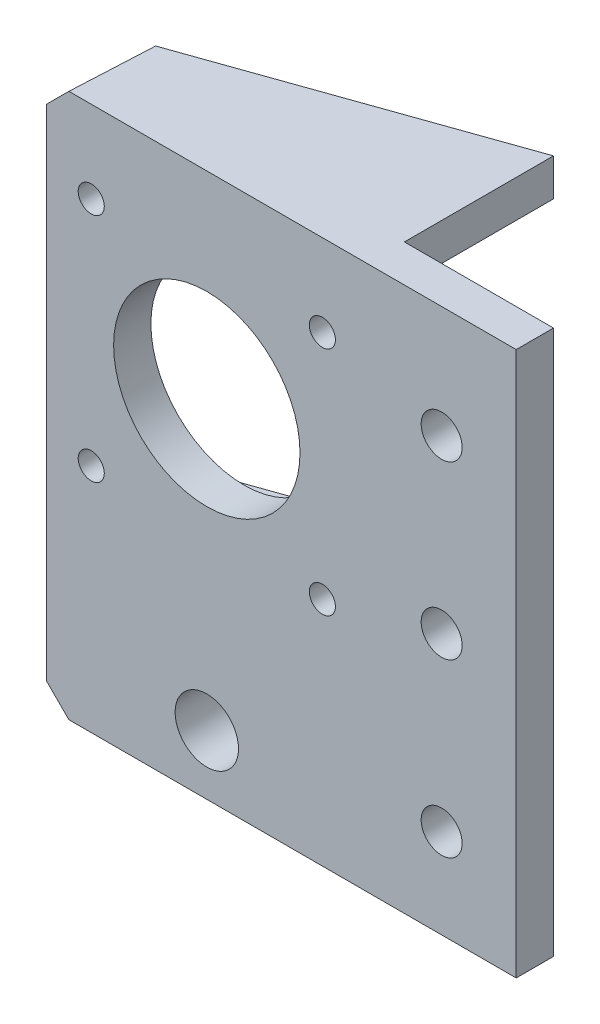
ISO-10303-21;
HEADER;
FILE_DESCRIPTION(('STEP AP214'),'2;1');
FILE_NAME('part.step','',(''),(''),'','','');
FILE_SCHEMA(('AUTOMOTIVE_DESIGN { 1 0 10303 214 1 1 1 1 }'));
ENDSEC;
DATA;
#1=APPLICATION_CONTEXT('core data for automotive mechanical design processes');
#2=APPLICATION_PROTOCOL_DEFINITION('international standard','automotive_design',2000,#1);
#3=PRODUCT_CONTEXT('',#1,'mechanical');
#4=PRODUCT('Part','Part','',(#3));
#5=PRODUCT_RELATED_PRODUCT_CATEGORY('part','',(#4));
#6=PRODUCT_DEFINITION_FORMATION('','',#4);
#7=PRODUCT_DEFINITION_CONTEXT('part definition',#1,'design');
#8=PRODUCT_DEFINITION('design','',#6,#7);
#9=PRODUCT_DEFINITION_SHAPE('','',#8);
#10=(LENGTH_UNIT() NAMED_UNIT(*) SI_UNIT(.MILLI.,.METRE.));
#11=(NAMED_UNIT(*) PLANE_ANGLE_UNIT() SI_UNIT($,.RADIAN.));
#12=(NAMED_UNIT(*) SI_UNIT($,.STERADIAN.) SOLID_ANGLE_UNIT());
#13=UNCERTAINTY_MEASURE_WITH_UNIT(LENGTH_MEASURE(1.E-05),#10,'distance_accuracy_value','');
#14=(GEOMETRIC_REPRESENTATION_CONTEXT(3) GLOBAL_UNCERTAINTY_ASSIGNED_CONTEXT((#13)) GLOBAL_UNIT_ASSIGNED_CONTEXT((#10,
#11,#12)) REPRESENTATION_CONTEXT('',''));
#15=CARTESIAN_POINT('',(0.,0.,0.));
#16=DIRECTION('',(0.,0.,1.));
#17=DIRECTION('',(1.,0.,0.));
#18=AXIS2_PLACEMENT_3D('',#15,#16,#17);
#19=CARTESIAN_POINT('',(23.027972027972,16.9685314685315,-20.));
#20=DIRECTION('',(-1.,0.,0.));
#21=DIRECTION('',(0.,0.,1.));
#22=AXIS2_PLACEMENT_3D('',#19,#20,#21);
#23=PLANE('',#22);
#24=DIRECTION('',(0.,-1.,0.));
#25=VECTOR('',#24,1.);
#26=CARTESIAN_POINT('',(23.027972027972,16.9685314685315,0.));
#27=LINE('',#26,#25);
#28=CARTESIAN_POINT('',(23.027972027972,16.9685314685315,0.));
#29=VERTEX_POINT('',#28);
#30=CARTESIAN_POINT('',(23.027972027972,11.9685314685315,0.));
#31=VERTEX_POINT('',#30);
#32=EDGE_CURVE('E169',#29,#31,#27,.T.);
#33=ORIENTED_EDGE('',*,*,#32,.T.);
#34=DIRECTION('',(0.,0.,-1.));
#35=VECTOR('',#34,1.);
#36=CARTESIAN_POINT('',(23.027972027972,11.9685314685315,-20.));
#37=LINE('',#36,#35);
#38=CARTESIAN_POINT('',(23.027972027972,11.9685314685315,-20.));
#39=VERTEX_POINT('',#38);
#40=EDGE_CURVE('E212',#31,#39,#37,.T.);
#41=ORIENTED_EDGE('',*,*,#40,.T.);
#42=DIRECTION('',(0.,-1.,0.));
#43=VECTOR('',#42,1.);
#44=CARTESIAN_POINT('',(23.027972027972,16.9685314685315,-20.));
#45=LINE('',#44,#43);
#46=CARTESIAN_POINT('',(23.027972027972,16.9685314685315,-20.));
#47=VERTEX_POINT('',#46);
#48=EDGE_CURVE('E228',#47,#39,#45,.T.);
#49=ORIENTED_EDGE('',*,*,#48,.F.);
#50=DIRECTION('',(0.,0.,-1.));
#51=VECTOR('',#50,1.);
#52=CARTESIAN_POINT('',(23.027972027972,16.9685314685315,-20.));
#53=LINE('',#52,#51);
#54=EDGE_CURVE('E151',#29,#47,#53,.T.);
#55=ORIENTED_EDGE('',*,*,#54,.F.);
#56=EDGE_LOOP('',(#33,#41,#49,#55));
#57=FACE_BOUND('',#56,.T.);
#58=ADVANCED_FACE('F39',(#57),#23,.F.);
#59=CARTESIAN_POINT('',(-19.972027972028,11.9685314685315,5.));
#60=DIRECTION('',(0.,-1.,0.));
#61=DIRECTION('',(0.,0.,-1.));
#62=AXIS2_PLACEMENT_3D('',#59,#60,#61);
#63=PLANE('',#62);
#64=DIRECTION('',(-0.0499376169439517,0.,0.998752338877842));
#65=VECTOR('',#64,1.);
#66=CARTESIAN_POINT('',(-19.972027972028,11.9685314685315,5.));
#67=LINE('',#66,#65);
#68=CARTESIAN_POINT('',(-19.7220279720277,11.9685314685315,0.));
#69=VERTEX_POINT('',#68);
#70=CARTESIAN_POINT('',(-19.972027972028,11.9685314685315,5.));
#71=VERTEX_POINT('',#70);
#72=EDGE_CURVE('E224',#69,#71,#67,.T.);
#73=ORIENTED_EDGE('',*,*,#72,.F.);
#74=DIRECTION('',(-1.,0.,0.));
#75=VECTOR('',#74,1.);
#76=CARTESIAN_POINT('',(-19.972027972028,11.9685314685315,0.));
#77=LINE('',#76,#75);
#78=CARTESIAN_POINT('',(-19.972027972028,11.9685314685315,0.));
#79=VERTEX_POINT('',#78);
#80=EDGE_CURVE('E293',#69,#79,#77,.T.);
#81=ORIENTED_EDGE('',*,*,#80,.T.);
#82=DIRECTION('',(0.,0.,-1.));
#83=VECTOR('',#82,1.);
#84=CARTESIAN_POINT('',(-19.972027972028,11.9685314685315,5.));
#85=LINE('',#84,#83);
#86=EDGE_CURVE('E163',#71,#79,#85,.T.);
#87=ORIENTED_EDGE('',*,*,#86,.F.);
#88=EDGE_LOOP('',(#73,#81,#87));
#89=FACE_BOUND('',#88,.T.);
#90=ADVANCED_FACE('F337',(#89),#63,.F.);
#91=CARTESIAN_POINT('',(0.,0.,0.));
#92=DIRECTION('',(0.,0.,1.));
#93=DIRECTION('',(1.,0.,0.));
#94=AXIS2_PLACEMENT_3D('',#91,#92,#93);
#95=PLANE('',#94);
#96=CARTESIAN_POINT('',(33.027972027972,-44.0314685314685,0.));
#97=DIRECTION('',(0.,0.,1.));
#98=DIRECTION('',(1.,0.,0.));
#99=AXIS2_PLACEMENT_3D('',#96,#97,#98);
#100=CIRCLE('',#99,2.75);
#101=CARTESIAN_POINT('',(35.777972027972,-44.0314685314685,0.));
#102=VERTEX_POINT('',#101);
#103=EDGE_CURVE('E178',#102,#102,#100,.T.);
#104=ORIENTED_EDGE('',*,*,#103,.T.);
#105=EDGE_LOOP('',(#104));
#106=FACE_BOUND('',#105,.T.);
#107=DIRECTION('',(0.,1.,0.));
#108=VECTOR('',#107,1.);
#109=CARTESIAN_POINT('',(-19.7220279720277,-36.0314685314685,0.));
#110=LINE('',#109,#108);
#111=CARTESIAN_POINT('',(-19.7220279720277,-36.0314685314685,0.));
#112=VERTEX_POINT('',#111);
#113=CARTESIAN_POINT('',(-19.7220279720277,-31.0314685314685,0.));
#114=VERTEX_POINT('',#113);
#115=EDGE_CURVE('E205',#112,#114,#110,.T.);
#116=ORIENTED_EDGE('',*,*,#115,.F.);
#117=DIRECTION('',(-1.,0.,0.));
#118=VECTOR('',#117,1.);
#119=CARTESIAN_POINT('',(23.027972027972,-36.0314685314685,0.));
#120=LINE('',#119,#118);
#121=CARTESIAN_POINT('',(23.027972027972,-36.0314685314685,0.));
#122=VERTEX_POINT('',#121);
#123=EDGE_CURVE('E189',#122,#112,#120,.T.);
#124=ORIENTED_EDGE('',*,*,#123,.F.);
#125=DIRECTION('',(0.,1.,0.));
#126=VECTOR('',#125,1.);
#127=CARTESIAN_POINT('',(23.027972027972,-36.0314685314685,0.));
#128=LINE('',#127,#126);
#129=CARTESIAN_POINT('',(23.027972027972,-31.0314685314685,0.));
#130=VERTEX_POINT('',#129);
#131=EDGE_CURVE('E208',#122,#130,#128,.T.);
#132=ORIENTED_EDGE('',*,*,#131,.T.);
#133=DIRECTION('',(-1.,0.,0.));
#134=VECTOR('',#133,1.);
#135=CARTESIAN_POINT('',(23.027972027972,-31.0314685314685,0.));
#136=LINE('',#135,#134);
#137=EDGE_CURVE('E200',#130,#114,#136,.T.);
#138=ORIENTED_EDGE('',*,*,#137,.T.);
#139=EDGE_LOOP('',(#116,#124,#132,#138));
#140=FACE_BOUND('',#139,.T.);
#141=CARTESIAN_POINT('',(33.027972027972,-21.0314685314685,0.));
#142=DIRECTION('',(0.,0.,1.));
#143=DIRECTION('',(1.,0.,0.));
#144=AXIS2_PLACEMENT_3D('',#141,#142,#143);
#145=CIRCLE('',#144,2.75);
#146=CARTESIAN_POINT('',(35.777972027972,-21.0314685314685,0.));
#147=VERTEX_POINT('',#146);
#148=EDGE_CURVE('E245',#147,#147,#145,.T.);
#149=ORIENTED_EDGE('',*,*,#148,.T.);
#150=EDGE_LOOP('',(#149));
#151=FACE_BOUND('',#150,.T.);
#152=CARTESIAN_POINT('',(33.027972027972,1.96853146853145,0.));
#153=DIRECTION('',(0.,0.,1.));
#154=DIRECTION('',(1.,0.,0.));
#155=AXIS2_PLACEMENT_3D('',#152,#153,#154);
#156=CIRCLE('',#155,2.75);
#157=CARTESIAN_POINT('',(35.777972027972,1.96853146853145,0.));
#158=VERTEX_POINT('',#157);
#159=EDGE_CURVE('E249',#158,#158,#156,.T.);
#160=ORIENTED_EDGE('',*,*,#159,.T.);
#161=EDGE_LOOP('',(#160));
#162=FACE_BOUND('',#161,.T.);
#163=CARTESIAN_POINT('',(1.52797202797203,-9.53146853146854,0.));
#164=DIRECTION('',(0.,0.,1.));
#165=DIRECTION('',(1.,0.,0.));
#166=AXIS2_PLACEMENT_3D('',#163,#164,#165);
#167=CIRCLE('',#166,12.5);
#168=CARTESIAN_POINT('',(14.027972027972,-9.53146853146854,0.));
#169=VERTEX_POINT('',#168);
#170=EDGE_CURVE('E255',#169,#169,#167,.T.);
#171=ORIENTED_EDGE('',*,*,#170,.T.);
#172=EDGE_LOOP('',(#171));
#173=FACE_BOUND('',#172,.T.);
#174=CARTESIAN_POINT('',(-13.972027972028,-25.0314685314685,0.));
#175=DIRECTION('',(0.,0.,1.));
#176=DIRECTION('',(1.,0.,0.));
#177=AXIS2_PLACEMENT_3D('',#174,#175,#176);
#178=CIRCLE('',#177,1.75);
#179=CARTESIAN_POINT('',(-12.222027972028,-25.0314685314685,0.));
#180=VERTEX_POINT('',#179);
#181=EDGE_CURVE('E261',#180,#180,#178,.T.);
#182=ORIENTED_EDGE('',*,*,#181,.T.);
#183=EDGE_LOOP('',(#182));
#184=FACE_BOUND('',#183,.T.);
#185=CARTESIAN_POINT('',(17.027972027972,-25.0314685314685,0.));
#186=DIRECTION('',(0.,0.,1.));
#187=DIRECTION('',(1.,0.,0.));
#188=AXIS2_PLACEMENT_3D('',#185,#186,#187);
#189=CIRCLE('',#188,1.75);
#190=CARTESIAN_POINT('',(18.777972027972,-25.0314685314685,0.));
#191=VERTEX_POINT('',#190);
#192=EDGE_CURVE('E267',#191,#191,#189,.T.);
#193=ORIENTED_EDGE('',*,*,#192,.T.);
#194=EDGE_LOOP('',(#193));
#195=FACE_BOUND('',#194,.T.);
#196=CARTESIAN_POINT('',(17.027972027972,5.96853146853146,0.));
#197=DIRECTION('',(0.,0.,1.));
#198=DIRECTION('',(1.,0.,0.));
#199=AXIS2_PLACEMENT_3D('',#196,#197,#198);
#200=CIRCLE('',#199,1.75);
#201=CARTESIAN_POINT('',(18.777972027972,5.96853146853146,0.));
#202=VERTEX_POINT('',#201);
#203=EDGE_CURVE('E273',#202,#202,#200,.T.);
#204=ORIENTED_EDGE('',*,*,#203,.T.);
#205=EDGE_LOOP('',(#204));
#206=FACE_BOUND('',#205,.T.);
#207=CARTESIAN_POINT('',(-13.972027972028,5.96853146853146,0.));
#208=DIRECTION('',(0.,0.,1.));
#209=DIRECTION('',(1.,0.,0.));
#210=AXIS2_PLACEMENT_3D('',#207,#208,#209);
#211=CIRCLE('',#210,1.75);
#212=CARTESIAN_POINT('',(-12.222027972028,5.96853146853146,0.));
#213=VERTEX_POINT('',#212);
#214=EDGE_CURVE('E279',#213,#213,#211,.T.);
#215=ORIENTED_EDGE('',*,*,#214,.T.);
#216=EDGE_LOOP('',(#215));
#217=FACE_BOUND('',#216,.T.);
#218=DIRECTION('',(1.,0.,0.));
#219=VECTOR('',#218,1.);
#220=CARTESIAN_POINT('',(-19.972027972028,-56.0314685314685,0.));
#221=LINE('',#220,#219);
#222=CARTESIAN_POINT('',(-16.972027972028,-56.0314685314685,0.));
#223=VERTEX_POINT('',#222);
#224=CARTESIAN_POINT('',(43.027972027972,-56.0314685314685,0.));
#225=VERTEX_POINT('',#224);
#226=EDGE_CURVE('E240',#223,#225,#221,.T.);
#227=ORIENTED_EDGE('',*,*,#226,.F.);
#228=DIRECTION('',(-0.707106781186547,0.707106781186548,0.));
#229=VECTOR('',#228,1.);
#230=CARTESIAN_POINT('',(-16.972027972028,-56.0314685314685,0.));
#231=LINE('',#230,#229);
#232=CARTESIAN_POINT('',(-19.972027972028,-53.0314685314685,0.));
#233=VERTEX_POINT('',#232);
#234=EDGE_CURVE('E47',#223,#233,#231,.T.);
#235=ORIENTED_EDGE('',*,*,#234,.T.);
#236=DIRECTION('',(0.,-1.,0.));
#237=VECTOR('',#236,1.);
#238=CARTESIAN_POINT('',(-19.972027972028,11.9685314685315,0.));
#239=LINE('',#238,#237);
#240=EDGE_CURVE('E285',#79,#233,#239,.T.);
#241=ORIENTED_EDGE('',*,*,#240,.F.);
#242=ORIENTED_EDGE('',*,*,#80,.F.);
#243=EDGE_CURVE('E289',#31,#69,#77,.T.);
#244=ORIENTED_EDGE('',*,*,#243,.F.);
#245=ORIENTED_EDGE('',*,*,#32,.F.);
#246=DIRECTION('',(-1.,0.,0.));
#247=VECTOR('',#246,1.);
#248=CARTESIAN_POINT('',(43.027972027972,16.9685314685315,0.));
#249=LINE('',#248,#247);
#250=CARTESIAN_POINT('',(43.027972027972,16.9685314685315,0.));
#251=VERTEX_POINT('',#250);
#252=EDGE_CURVE('E170',#251,#29,#249,.T.);
#253=ORIENTED_EDGE('',*,*,#252,.F.);
#254=DIRECTION('',(0.,1.,0.));
#255=VECTOR('',#254,1.);
#256=CARTESIAN_POINT('',(43.027972027972,11.9685314685315,0.));
#257=LINE('',#256,#255);
#258=EDGE_CURVE('E168',#225,#251,#257,.T.);
#259=ORIENTED_EDGE('',*,*,#258,.F.);
#260=EDGE_LOOP('',(#227,#235,#241,#242,#244,#245,#253,#259));
#261=FACE_BOUND('',#260,.T.);
#262=CARTESIAN_POINT('',(1.52797202797204,-48.0314685314685,0.));
#263=DIRECTION('',(0.,0.,1.));
#264=DIRECTION('',(1.,0.,0.));
#265=AXIS2_PLACEMENT_3D('',#262,#263,#264);
#266=CIRCLE('',#265,7.75);
#267=CARTESIAN_POINT('',(9.27797202797204,-48.0314685314685,0.));
#268=VERTEX_POINT('',#267);
#269=EDGE_CURVE('E297',#268,#268,#266,.F.);
#270=ORIENTED_EDGE('',*,*,#269,.F.);
#271=EDGE_LOOP('',(#270));
#272=FACE_BOUND('',#271,.T.);
#273=ADVANCED_FACE('F313',(#106,#140,#151,#162,#173,#184,#195,#206,#217,#261,#272),#95,.F.);
#274=CARTESIAN_POINT('',(0.,0.,5.));
#275=DIRECTION('',(0.,0.,1.));
#276=DIRECTION('',(1.,0.,0.));
#277=AXIS2_PLACEMENT_3D('',#274,#275,#276);
#278=PLANE('',#277);
#279=CARTESIAN_POINT('',(33.027972027972,-44.0314685314685,5.));
#280=DIRECTION('',(0.,0.,1.));
#281=DIRECTION('',(1.,0.,0.));
#282=AXIS2_PLACEMENT_3D('',#279,#280,#281);
#283=CIRCLE('',#282,2.75);
#284=CARTESIAN_POINT('',(35.777972027972,-44.0314685314685,5.));
#285=VERTEX_POINT('',#284);
#286=EDGE_CURVE('E172',#285,#285,#283,.T.);
#287=ORIENTED_EDGE('',*,*,#286,.F.);
#288=EDGE_LOOP('',(#287));
#289=FACE_BOUND('',#288,.T.);
#290=CARTESIAN_POINT('',(1.52797202797204,-48.0314685314685,5.));
#291=DIRECTION('',(0.,0.,1.));
#292=DIRECTION('',(1.,0.,0.));
#293=AXIS2_PLACEMENT_3D('',#290,#291,#292);
#294=CIRCLE('',#293,4.25);
#295=CARTESIAN_POINT('',(5.77797202797204,-48.0314685314685,5.));
#296=VERTEX_POINT('',#295);
#297=EDGE_CURVE('E237',#296,#296,#294,.T.);
#298=ORIENTED_EDGE('',*,*,#297,.F.);
#299=EDGE_LOOP('',(#298));
#300=FACE_BOUND('',#299,.T.);
#301=CARTESIAN_POINT('',(33.027972027972,1.96853146853145,5.));
#302=DIRECTION('',(0.,0.,1.));
#303=DIRECTION('',(1.,0.,0.));
#304=AXIS2_PLACEMENT_3D('',#301,#302,#303);
#305=CIRCLE('',#304,2.75);
#306=CARTESIAN_POINT('',(35.777972027972,1.96853146853145,5.));
#307=VERTEX_POINT('',#306);
#308=EDGE_CURVE('E252',#307,#307,#305,.T.);
#309=ORIENTED_EDGE('',*,*,#308,.F.);
#310=EDGE_LOOP('',(#309));
#311=FACE_BOUND('',#310,.T.);
#312=CARTESIAN_POINT('',(-13.972027972028,-25.0314685314685,5.));
#313=DIRECTION('',(0.,0.,1.));
#314=DIRECTION('',(1.,0.,0.));
#315=AXIS2_PLACEMENT_3D('',#312,#313,#314);
#316=CIRCLE('',#315,1.75);
#317=CARTESIAN_POINT('',(-12.222027972028,-25.0314685314685,5.));
#318=VERTEX_POINT('',#317);
#319=EDGE_CURVE('E264',#318,#318,#316,.T.);
#320=ORIENTED_EDGE('',*,*,#319,.F.);
#321=EDGE_LOOP('',(#320));
#322=FACE_BOUND('',#321,.T.);
#323=CARTESIAN_POINT('',(17.027972027972,5.96853146853146,5.));
#324=DIRECTION('',(0.,0.,1.));
#325=DIRECTION('',(1.,0.,0.));
#326=AXIS2_PLACEMENT_3D('',#323,#324,#325);
#327=CIRCLE('',#326,1.75);
#328=CARTESIAN_POINT('',(18.777972027972,5.96853146853146,5.));
#329=VERTEX_POINT('',#328);
#330=EDGE_CURVE('E276',#329,#329,#327,.T.);
#331=ORIENTED_EDGE('',*,*,#330,.F.);
#332=EDGE_LOOP('',(#331));
#333=FACE_BOUND('',#332,.T.);
#334=DIRECTION('',(1.,0.,0.));
#335=VECTOR('',#334,1.);
#336=CARTESIAN_POINT('',(23.027972027972,16.9685314685315,5.));
#337=LINE('',#336,#335);
#338=CARTESIAN_POINT('',(-16.9682803128529,16.9685314685315,5.));
#339=VERTEX_POINT('',#338);
#340=CARTESIAN_POINT('',(43.027972027972,16.9685314685315,5.));
#341=VERTEX_POINT('',#340);
#342=EDGE_CURVE('E140',#339,#341,#337,.T.);
#343=ORIENTED_EDGE('',*,*,#342,.F.);
#344=DIRECTION('',(-0.707548033511042,-0.706665253337574,0.));
#345=VECTOR('',#344,1.);
#346=CARTESIAN_POINT('',(-16.9578073436204,16.9789913710474,5.));
#347=LINE('',#346,#345);
#348=CARTESIAN_POINT('',(-19.972027972028,13.9685314685315,5.));
#349=VERTEX_POINT('',#348);
#350=EDGE_CURVE('E303',#339,#349,#347,.T.);
#351=ORIENTED_EDGE('',*,*,#350,.T.);
#352=DIRECTION('',(0.,-1.,0.));
#353=VECTOR('',#352,1.);
#354=CARTESIAN_POINT('',(-19.972027972028,16.9685314685315,5.));
#355=LINE('',#354,#353);
#356=EDGE_CURVE('E217',#349,#71,#355,.T.);
#357=ORIENTED_EDGE('',*,*,#356,.T.);
#358=DIRECTION('',(0.,-1.,0.));
#359=VECTOR('',#358,1.);
#360=CARTESIAN_POINT('',(-19.972027972028,11.9685314685315,5.));
#361=LINE('',#360,#359);
#362=CARTESIAN_POINT('',(-19.972027972028,-53.0314685314685,5.));
#363=VERTEX_POINT('',#362);
#364=EDGE_CURVE('E164',#71,#363,#361,.T.);
#365=ORIENTED_EDGE('',*,*,#364,.T.);
#366=DIRECTION('',(0.707106781186547,-0.707106781186548,0.));
#367=VECTOR('',#366,1.);
#368=CARTESIAN_POINT('',(-36.5017482517483,-36.5017482517482,5.));
#369=LINE('',#368,#367);
#370=CARTESIAN_POINT('',(-16.972027972028,-56.0314685314685,5.));
#371=VERTEX_POINT('',#370);
#372=EDGE_CURVE('E301',#363,#371,#369,.T.);
#373=ORIENTED_EDGE('',*,*,#372,.T.);
#374=DIRECTION('',(-1.,0.,0.));
#375=VECTOR('',#374,1.);
#376=CARTESIAN_POINT('',(43.027972027972,-56.0314685314685,5.));
#377=LINE('',#376,#375);
#378=CARTESIAN_POINT('',(43.027972027972,-56.0314685314685,5.));
#379=VERTEX_POINT('',#378);
#380=EDGE_CURVE('E159',#379,#371,#377,.T.);
#381=ORIENTED_EDGE('',*,*,#380,.F.);
#382=DIRECTION('',(0.,1.,0.));
#383=VECTOR('',#382,1.);
#384=CARTESIAN_POINT('',(43.027972027972,11.9685314685315,5.));
#385=LINE('',#384,#383);
#386=EDGE_CURVE('E155',#379,#341,#385,.T.);
#387=ORIENTED_EDGE('',*,*,#386,.T.);
#388=EDGE_LOOP('',(#343,#351,#357,#365,#373,#381,#387));
#389=FACE_BOUND('',#388,.T.);
#390=CARTESIAN_POINT('',(-13.972027972028,5.96853146853146,5.));
#391=DIRECTION('',(0.,0.,1.));
#392=DIRECTION('',(1.,0.,0.));
#393=AXIS2_PLACEMENT_3D('',#390,#391,#392);
#394=CIRCLE('',#393,1.75);
#395=CARTESIAN_POINT('',(-12.222027972028,5.96853146853146,5.));
#396=VERTEX_POINT('',#395);
#397=EDGE_CURVE('E282',#396,#396,#394,.T.);
#398=ORIENTED_EDGE('',*,*,#397,.F.);
#399=EDGE_LOOP('',(#398));
#400=FACE_BOUND('',#399,.T.);
#401=CARTESIAN_POINT('',(17.027972027972,-25.0314685314685,5.));
#402=DIRECTION('',(0.,0.,1.));
#403=DIRECTION('',(1.,0.,0.));
#404=AXIS2_PLACEMENT_3D('',#401,#402,#403);
#405=CIRCLE('',#404,1.75);
#406=CARTESIAN_POINT('',(18.777972027972,-25.0314685314685,5.));
#407=VERTEX_POINT('',#406);
#408=EDGE_CURVE('E270',#407,#407,#405,.T.);
#409=ORIENTED_EDGE('',*,*,#408,.F.);
#410=EDGE_LOOP('',(#409));
#411=FACE_BOUND('',#410,.T.);
#412=CARTESIAN_POINT('',(1.52797202797203,-9.53146853146854,5.));
#413=DIRECTION('',(0.,0.,1.));
#414=DIRECTION('',(1.,0.,0.));
#415=AXIS2_PLACEMENT_3D('',#412,#413,#414);
#416=CIRCLE('',#415,12.5);
#417=CARTESIAN_POINT('',(14.027972027972,-9.53146853146854,5.));
#418=VERTEX_POINT('',#417);
#419=EDGE_CURVE('E258',#418,#418,#416,.T.);
#420=ORIENTED_EDGE('',*,*,#419,.F.);
#421=EDGE_LOOP('',(#420));
#422=FACE_BOUND('',#421,.T.);
#423=CARTESIAN_POINT('',(33.027972027972,-21.0314685314685,5.));
#424=DIRECTION('',(0.,0.,1.));
#425=DIRECTION('',(1.,0.,0.));
#426=AXIS2_PLACEMENT_3D('',#423,#424,#425);
#427=CIRCLE('',#426,2.75);
#428=CARTESIAN_POINT('',(35.777972027972,-21.0314685314685,5.));
#429=VERTEX_POINT('',#428);
#430=EDGE_CURVE('E246',#429,#429,#427,.T.);
#431=ORIENTED_EDGE('',*,*,#430,.F.);
#432=EDGE_LOOP('',(#431));
#433=FACE_BOUND('',#432,.T.);
#434=ADVANCED_FACE('F156',(#289,#300,#311,#322,#333,#389,#400,#411,#422,#433),#278,.T.);
#435=CARTESIAN_POINT('',(-19.972027972028,11.9685314685315,5.));
#436=DIRECTION('',(1.,0.,0.));
#437=DIRECTION('',(0.,1.,0.));
#438=AXIS2_PLACEMENT_3D('',#435,#436,#437);
#439=PLANE('',#438);
#440=ORIENTED_EDGE('',*,*,#240,.T.);
#441=DIRECTION('',(0.,0.,1.));
#442=VECTOR('',#441,1.);
#443=CARTESIAN_POINT('',(-19.972027972028,-53.0314685314685,5.));
#444=LINE('',#443,#442);
#445=EDGE_CURVE('E11',#233,#363,#444,.T.);
#446=ORIENTED_EDGE('',*,*,#445,.T.);
#447=ORIENTED_EDGE('',*,*,#364,.F.);
#448=ORIENTED_EDGE('',*,*,#86,.T.);
#449=EDGE_LOOP('',(#440,#446,#447,#448));
#450=FACE_BOUND('',#449,.T.);
#451=ADVANCED_FACE('F401',(#450),#439,.F.);
#452=CARTESIAN_POINT('',(43.027972027972,11.9685314685315,5.));
#453=DIRECTION('',(-1.,0.,0.));
#454=DIRECTION('',(0.,0.,1.));
#455=AXIS2_PLACEMENT_3D('',#452,#453,#454);
#456=PLANE('',#455);
#457=ORIENTED_EDGE('',*,*,#258,.T.);
#458=DIRECTION('',(0.,0.,-1.));
#459=VECTOR('',#458,1.);
#460=CARTESIAN_POINT('',(43.027972027972,16.9685314685315,5.));
#461=LINE('',#460,#459);
#462=EDGE_CURVE('E146',#341,#251,#461,.T.);
#463=ORIENTED_EDGE('',*,*,#462,.F.);
#464=ORIENTED_EDGE('',*,*,#386,.F.);
#465=DIRECTION('',(0.,0.,1.));
#466=VECTOR('',#465,1.);
#467=CARTESIAN_POINT('',(43.027972027972,-56.0314685314685,0.));
#468=LINE('',#467,#466);
#469=EDGE_CURVE('E242',#225,#379,#468,.T.);
#470=ORIENTED_EDGE('',*,*,#469,.F.);
#471=EDGE_LOOP('',(#457,#463,#464,#470));
#472=FACE_BOUND('',#471,.T.);
#473=ADVANCED_FACE('F166',(#472),#456,.F.);
#474=CARTESIAN_POINT('',(-13.972027972028,5.96853146853146,5.));
#475=DIRECTION('',(0.,0.,-1.));
#476=DIRECTION('',(-1.,0.,0.));
#477=AXIS2_PLACEMENT_3D('',#474,#475,#476);
#478=CYLINDRICAL_SURFACE('',#477,1.75);
#479=ORIENTED_EDGE('',*,*,#397,.T.);
#480=EDGE_LOOP('',(#479));
#481=FACE_BOUND('',#480,.T.);
#482=ORIENTED_EDGE('',*,*,#214,.F.);
#483=EDGE_LOOP('',(#482));
#484=FACE_BOUND('',#483,.T.);
#485=ADVANCED_FACE('F394',(#481,#484),#478,.F.);
#486=CARTESIAN_POINT('',(17.027972027972,5.96853146853146,5.));
#487=DIRECTION('',(0.,0.,-1.));
#488=DIRECTION('',(-1.,0.,0.));
#489=AXIS2_PLACEMENT_3D('',#486,#487,#488);
#490=CYLINDRICAL_SURFACE('',#489,1.75);
#491=ORIENTED_EDGE('',*,*,#330,.T.);
#492=EDGE_LOOP('',(#491));
#493=FACE_BOUND('',#492,.T.);
#494=ORIENTED_EDGE('',*,*,#203,.F.);
#495=EDGE_LOOP('',(#494));
#496=FACE_BOUND('',#495,.T.);
#497=ADVANCED_FACE('F390',(#493,#496),#490,.F.);
#498=CARTESIAN_POINT('',(17.027972027972,-25.0314685314685,5.));
#499=DIRECTION('',(0.,0.,-1.));
#500=DIRECTION('',(-1.,0.,0.));
#501=AXIS2_PLACEMENT_3D('',#498,#499,#500);
#502=CYLINDRICAL_SURFACE('',#501,1.75);
#503=ORIENTED_EDGE('',*,*,#408,.T.);
#504=EDGE_LOOP('',(#503));
#505=FACE_BOUND('',#504,.T.);
#506=ORIENTED_EDGE('',*,*,#192,.F.);
#507=EDGE_LOOP('',(#506));
#508=FACE_BOUND('',#507,.T.);
#509=ADVANCED_FACE('F386',(#505,#508),#502,.F.);
#510=CARTESIAN_POINT('',(-13.972027972028,-25.0314685314685,5.));
#511=DIRECTION('',(0.,0.,-1.));
#512=DIRECTION('',(-1.,0.,0.));
#513=AXIS2_PLACEMENT_3D('',#510,#511,#512);
#514=CYLINDRICAL_SURFACE('',#513,1.75);
#515=ORIENTED_EDGE('',*,*,#319,.T.);
#516=EDGE_LOOP('',(#515));
#517=FACE_BOUND('',#516,.T.);
#518=ORIENTED_EDGE('',*,*,#181,.F.);
#519=EDGE_LOOP('',(#518));
#520=FACE_BOUND('',#519,.T.);
#521=ADVANCED_FACE('F382',(#517,#520),#514,.F.);
#522=CARTESIAN_POINT('',(1.52797202797203,-9.53146853146854,5.));
#523=DIRECTION('',(0.,0.,-1.));
#524=DIRECTION('',(-1.,0.,0.));
#525=AXIS2_PLACEMENT_3D('',#522,#523,#524);
#526=CYLINDRICAL_SURFACE('',#525,12.5);
#527=ORIENTED_EDGE('',*,*,#419,.T.);
#528=EDGE_LOOP('',(#527));
#529=FACE_BOUND('',#528,.T.);
#530=ORIENTED_EDGE('',*,*,#170,.F.);
#531=EDGE_LOOP('',(#530));
#532=FACE_BOUND('',#531,.T.);
#533=ADVANCED_FACE('F378',(#529,#532),#526,.F.);
#534=CARTESIAN_POINT('',(33.027972027972,1.96853146853145,5.));
#535=DIRECTION('',(0.,0.,-1.));
#536=DIRECTION('',(-1.,0.,0.));
#537=AXIS2_PLACEMENT_3D('',#534,#535,#536);
#538=CYLINDRICAL_SURFACE('',#537,2.75);
#539=ORIENTED_EDGE('',*,*,#308,.T.);
#540=EDGE_LOOP('',(#539));
#541=FACE_BOUND('',#540,.T.);
#542=ORIENTED_EDGE('',*,*,#159,.F.);
#543=EDGE_LOOP('',(#542));
#544=FACE_BOUND('',#543,.T.);
#545=ADVANCED_FACE('F374',(#541,#544),#538,.F.);
#546=CARTESIAN_POINT('',(33.027972027972,-21.0314685314685,5.));
#547=DIRECTION('',(0.,0.,-1.));
#548=DIRECTION('',(-1.,0.,0.));
#549=AXIS2_PLACEMENT_3D('',#546,#547,#548);
#550=CYLINDRICAL_SURFACE('',#549,2.75);
#551=ORIENTED_EDGE('',*,*,#430,.T.);
#552=EDGE_LOOP('',(#551));
#553=FACE_BOUND('',#552,.T.);
#554=ORIENTED_EDGE('',*,*,#148,.F.);
#555=EDGE_LOOP('',(#554));
#556=FACE_BOUND('',#555,.T.);
#557=ADVANCED_FACE('F371',(#553,#556),#550,.F.);
#558=CARTESIAN_POINT('',(0.,-56.0314685314685,0.));
#559=DIRECTION('',(0.,-1.,0.));
#560=DIRECTION('',(0.,0.,-1.));
#561=AXIS2_PLACEMENT_3D('',#558,#559,#560);
#562=PLANE('',#561);
#563=ORIENTED_EDGE('',*,*,#380,.T.);
#564=DIRECTION('',(0.,0.,-1.));
#565=VECTOR('',#564,1.);
#566=CARTESIAN_POINT('',(-16.972027972028,-56.0314685314685,0.));
#567=LINE('',#566,#565);
#568=EDGE_CURVE('E309',#371,#223,#567,.T.);
#569=ORIENTED_EDGE('',*,*,#568,.T.);
#570=ORIENTED_EDGE('',*,*,#226,.T.);
#571=ORIENTED_EDGE('',*,*,#469,.T.);
#572=EDGE_LOOP('',(#563,#569,#570,#571));
#573=FACE_BOUND('',#572,.T.);
#574=ADVANCED_FACE('F311',(#573),#562,.T.);
#575=CARTESIAN_POINT('',(1.52797202797204,-48.0314685314685,-20.));
#576=DIRECTION('',(0.,0.,1.));
#577=DIRECTION('',(1.,0.,0.));
#578=AXIS2_PLACEMENT_3D('',#575,#576,#577);
#579=CYLINDRICAL_SURFACE('',#578,4.25);
#580=ORIENTED_EDGE('',*,*,#297,.T.);
#581=EDGE_LOOP('',(#580));
#582=FACE_BOUND('',#581,.T.);
#583=CARTESIAN_POINT('',(1.52797202797204,-48.0314685314685,-10.));
#584=DIRECTION('',(0.,0.,-1.));
#585=DIRECTION('',(-1.,0.,0.));
#586=AXIS2_PLACEMENT_3D('',#583,#584,#585);
#587=CIRCLE('',#586,4.25);
#588=CARTESIAN_POINT('',(-2.72202797202796,-48.0314685314685,-10.));
#589=VERTEX_POINT('',#588);
#590=EDGE_CURVE('E231',#589,#589,#587,.T.);
#591=ORIENTED_EDGE('',*,*,#590,.T.);
#592=EDGE_LOOP('',(#591));
#593=FACE_BOUND('',#592,.T.);
#594=ADVANCED_FACE('F363',(#582,#593),#579,.F.);
#595=CARTESIAN_POINT('',(1.52797202797204,-48.0314685314685,-10.));
#596=DIRECTION('',(0.,0.,-1.));
#597=DIRECTION('',(-1.,0.,0.));
#598=AXIS2_PLACEMENT_3D('',#595,#596,#597);
#599=PLANE('',#598);
#600=CARTESIAN_POINT('',(1.52797202797204,-48.0314685314685,-10.));
#601=DIRECTION('',(0.,0.,-1.));
#602=DIRECTION('',(-1.,0.,0.));
#603=AXIS2_PLACEMENT_3D('',#600,#601,#602);
#604=CIRCLE('',#603,7.75);
#605=CARTESIAN_POINT('',(-6.22202797202796,-48.0314685314685,-10.));
#606=VERTEX_POINT('',#605);
#607=EDGE_CURVE('E234',#606,#606,#604,.T.);
#608=ORIENTED_EDGE('',*,*,#607,.T.);
#609=EDGE_LOOP('',(#608));
#610=FACE_BOUND('',#609,.T.);
#611=ORIENTED_EDGE('',*,*,#590,.F.);
#612=EDGE_LOOP('',(#611));
#613=FACE_BOUND('',#612,.T.);
#614=ADVANCED_FACE('F350',(#610,#613),#599,.T.);
#615=CARTESIAN_POINT('',(1.52797202797204,-48.0314685314685,-10.));
#616=DIRECTION('',(0.,0.,1.));
#617=DIRECTION('',(1.,0.,0.));
#618=AXIS2_PLACEMENT_3D('',#615,#616,#617);
#619=CYLINDRICAL_SURFACE('',#618,7.75);
#620=ORIENTED_EDGE('',*,*,#607,.F.);
#621=EDGE_LOOP('',(#620));
#622=FACE_BOUND('',#621,.T.);
#623=ORIENTED_EDGE('',*,*,#269,.T.);
#624=EDGE_LOOP('',(#623));
#625=FACE_BOUND('',#624,.T.);
#626=ADVANCED_FACE('F343',(#622,#625),#619,.T.);
#627=CARTESIAN_POINT('',(0.,11.9685314685315,0.));
#628=DIRECTION('',(0.,1.,0.));
#629=DIRECTION('',(0.,0.,1.));
#630=AXIS2_PLACEMENT_3D('',#627,#628,#629);
#631=PLANE('',#630);
#632=ORIENTED_EDGE('',*,*,#40,.F.);
#633=ORIENTED_EDGE('',*,*,#243,.T.);
#634=CARTESIAN_POINT('',(-19.4720279720274,11.9685314685315,-5.));
#635=VERTEX_POINT('',#634);
#636=EDGE_CURVE('E152',#635,#69,#67,.T.);
#637=ORIENTED_EDGE('',*,*,#636,.F.);
#638=DIRECTION('',(-0.942990333582888,0.,0.332820117735142));
#639=VECTOR('',#638,1.);
#640=CARTESIAN_POINT('',(-19.4720279720274,11.9685314685315,-5.));
#641=LINE('',#640,#639);
#642=EDGE_CURVE('E219',#39,#635,#641,.T.);
#643=ORIENTED_EDGE('',*,*,#642,.F.);
#644=EDGE_LOOP('',(#632,#633,#637,#643));
#645=FACE_BOUND('',#644,.T.);
#646=ADVANCED_FACE('F341',(#645),#631,.F.);
#647=CARTESIAN_POINT('',(-19.4720279720274,16.9685314685315,-5.));
#648=DIRECTION('',(0.332820117735142,0.,0.942990333582888));
#649=DIRECTION('',(0.942990333582888,0.,-0.332820117735142));
#650=AXIS2_PLACEMENT_3D('',#647,#648,#649);
#651=PLANE('',#650);
#652=DIRECTION('',(0.,-1.,0.));
#653=VECTOR('',#652,1.);
#654=CARTESIAN_POINT('',(-19.4720279720274,16.9685314685315,-5.));
#655=LINE('',#654,#653);
#656=CARTESIAN_POINT('',(-19.4720279720274,13.9685314685315,-5.));
#657=VERTEX_POINT('',#656);
#658=EDGE_CURVE('E226',#657,#635,#655,.T.);
#659=ORIENTED_EDGE('',*,*,#658,.F.);
#660=DIRECTION('',(0.692181886166218,0.679118543424362,-0.244299489235139));
#661=VECTOR('',#660,1.);
#662=CARTESIAN_POINT('',(-17.4269664686488,15.9749971347743,-5.72178641295717));
#663=LINE('',#662,#661);
#664=CARTESIAN_POINT('',(-16.4143207740646,16.9685314685315,-6.07919077575158));
#665=VERTEX_POINT('',#664);
#666=EDGE_CURVE('E307',#657,#665,#663,.T.);
#667=ORIENTED_EDGE('',*,*,#666,.T.);
#668=DIRECTION('',(-0.942990333582888,0.,0.332820117735142));
#669=VECTOR('',#668,1.);
#670=CARTESIAN_POINT('',(-19.4720279720274,16.9685314685315,-5.));
#671=LINE('',#670,#669);
#672=EDGE_CURVE('E215',#47,#665,#671,.T.);
#673=ORIENTED_EDGE('',*,*,#672,.F.);
#674=ORIENTED_EDGE('',*,*,#48,.T.);
#675=ORIENTED_EDGE('',*,*,#642,.T.);
#676=EDGE_LOOP('',(#659,#667,#673,#674,#675));
#677=FACE_BOUND('',#676,.T.);
#678=ADVANCED_FACE('F324',(#677),#651,.F.);
#679=CARTESIAN_POINT('',(-19.972027972028,16.9685314685315,5.));
#680=DIRECTION('',(0.998752338877842,0.,0.0499376169439517));
#681=DIRECTION('',(0.0499376169439517,0.,-0.998752338877842));
#682=AXIS2_PLACEMENT_3D('',#679,#680,#681);
#683=PLANE('',#682);
#684=ORIENTED_EDGE('',*,*,#356,.F.);
#685=DIRECTION('',(0.0499376169439517,0.,-0.998752338877842));
#686=VECTOR('',#685,1.);
#687=CARTESIAN_POINT('',(-19.4720279720274,13.9685314685315,-5.));
#688=LINE('',#687,#686);
#689=EDGE_CURVE('E305',#349,#657,#688,.T.);
#690=ORIENTED_EDGE('',*,*,#689,.T.);
#691=ORIENTED_EDGE('',*,*,#658,.T.);
#692=ORIENTED_EDGE('',*,*,#636,.T.);
#693=ORIENTED_EDGE('',*,*,#72,.T.);
#694=EDGE_LOOP('',(#684,#690,#691,#692,#693));
#695=FACE_BOUND('',#694,.T.);
#696=ADVANCED_FACE('F333',(#695),#683,.F.);
#697=CARTESIAN_POINT('',(0.,16.9685314685315,0.));
#698=DIRECTION('',(0.,1.,0.));
#699=DIRECTION('',(0.,0.,1.));
#700=AXIS2_PLACEMENT_3D('',#697,#698,#699);
#701=PLANE('',#700);
#702=ORIENTED_EDGE('',*,*,#672,.T.);
#703=DIRECTION('',(-0.0499376169439517,0.,0.998752338877842));
#704=VECTOR('',#703,1.);
#705=CARTESIAN_POINT('',(-16.9757709553945,16.9685314685315,5.14981285083185));
#706=LINE('',#705,#704);
#707=EDGE_CURVE('E149',#665,#339,#706,.T.);
#708=ORIENTED_EDGE('',*,*,#707,.T.);
#709=ORIENTED_EDGE('',*,*,#342,.T.);
#710=ORIENTED_EDGE('',*,*,#462,.T.);
#711=ORIENTED_EDGE('',*,*,#252,.T.);
#712=ORIENTED_EDGE('',*,*,#54,.T.);
#713=EDGE_LOOP('',(#702,#708,#709,#710,#711,#712));
#714=FACE_BOUND('',#713,.T.);
#715=ADVANCED_FACE('F143',(#714),#701,.T.);
#716=CARTESIAN_POINT('',(-19.4720279720274,-36.0314685314685,-5.));
#717=DIRECTION('',(0.332820117735142,0.,0.942990333582888));
#718=DIRECTION('',(0.942990333582888,0.,-0.332820117735142));
#719=AXIS2_PLACEMENT_3D('',#716,#717,#718);
#720=PLANE('',#719);
#721=DIRECTION('',(0.942990333582888,0.,-0.332820117735142));
#722=VECTOR('',#721,1.);
#723=CARTESIAN_POINT('',(-19.4720279720274,-31.0314685314685,-5.));
#724=LINE('',#723,#722);
#725=CARTESIAN_POINT('',(-19.4720279720274,-31.0314685314685,-5.));
#726=VERTEX_POINT('',#725);
#727=CARTESIAN_POINT('',(23.027972027972,-31.0314685314685,-20.));
#728=VERTEX_POINT('',#727);
#729=EDGE_CURVE('E181',#726,#728,#724,.T.);
#730=ORIENTED_EDGE('',*,*,#729,.T.);
#731=DIRECTION('',(0.,1.,0.));
#732=VECTOR('',#731,1.);
#733=CARTESIAN_POINT('',(23.027972027972,-36.0314685314685,-20.));
#734=LINE('',#733,#732);
#735=CARTESIAN_POINT('',(23.027972027972,-36.0314685314685,-20.));
#736=VERTEX_POINT('',#735);
#737=EDGE_CURVE('E210',#736,#728,#734,.T.);
#738=ORIENTED_EDGE('',*,*,#737,.F.);
#739=DIRECTION('',(0.942990333582888,0.,-0.332820117735142));
#740=VECTOR('',#739,1.);
#741=CARTESIAN_POINT('',(-19.4720279720274,-36.0314685314685,-5.));
#742=LINE('',#741,#740);
#743=CARTESIAN_POINT('',(-19.4720279720274,-36.0314685314685,-5.));
#744=VERTEX_POINT('',#743);
#745=EDGE_CURVE('E182',#744,#736,#742,.T.);
#746=ORIENTED_EDGE('',*,*,#745,.F.);
#747=DIRECTION('',(0.,1.,0.));
#748=VECTOR('',#747,1.);
#749=CARTESIAN_POINT('',(-19.4720279720274,-36.0314685314685,-5.));
#750=LINE('',#749,#748);
#751=EDGE_CURVE('E194',#744,#726,#750,.T.);
#752=ORIENTED_EDGE('',*,*,#751,.T.);
#753=EDGE_LOOP('',(#730,#738,#746,#752));
#754=FACE_BOUND('',#753,.T.);
#755=ADVANCED_FACE('F437',(#754),#720,.F.);
#756=CARTESIAN_POINT('',(23.027972027972,-36.0314685314685,-20.));
#757=DIRECTION('',(-1.,0.,0.));
#758=DIRECTION('',(0.,0.,1.));
#759=AXIS2_PLACEMENT_3D('',#756,#757,#758);
#760=PLANE('',#759);
#761=DIRECTION('',(0.,0.,1.));
#762=VECTOR('',#761,1.);
#763=CARTESIAN_POINT('',(23.027972027972,-31.0314685314685,-20.));
#764=LINE('',#763,#762);
#765=EDGE_CURVE('E197',#728,#130,#764,.T.);
#766=ORIENTED_EDGE('',*,*,#765,.T.);
#767=ORIENTED_EDGE('',*,*,#131,.F.);
#768=DIRECTION('',(0.,0.,1.));
#769=VECTOR('',#768,1.);
#770=CARTESIAN_POINT('',(23.027972027972,-36.0314685314685,-20.));
#771=LINE('',#770,#769);
#772=EDGE_CURVE('E185',#736,#122,#771,.T.);
#773=ORIENTED_EDGE('',*,*,#772,.F.);
#774=ORIENTED_EDGE('',*,*,#737,.T.);
#775=EDGE_LOOP('',(#766,#767,#773,#774));
#776=FACE_BOUND('',#775,.T.);
#777=ADVANCED_FACE('F433',(#776),#760,.F.);
#778=CARTESIAN_POINT('',(-19.7220279720277,-36.0314685314685,0.));
#779=DIRECTION('',(0.998752338877842,0.,0.0499376169439517));
#780=DIRECTION('',(0.0499376169439517,0.,-0.998752338877842));
#781=AXIS2_PLACEMENT_3D('',#778,#779,#780);
#782=PLANE('',#781);
#783=DIRECTION('',(0.0499376169439517,0.,-0.998752338877842));
#784=VECTOR('',#783,1.);
#785=CARTESIAN_POINT('',(-19.7220279720277,-31.0314685314685,0.));
#786=LINE('',#785,#784);
#787=EDGE_CURVE('E186',#114,#726,#786,.T.);
#788=ORIENTED_EDGE('',*,*,#787,.T.);
#789=ORIENTED_EDGE('',*,*,#751,.F.);
#790=DIRECTION('',(0.0499376169439517,0.,-0.998752338877842));
#791=VECTOR('',#790,1.);
#792=CARTESIAN_POINT('',(-19.7220279720277,-36.0314685314685,0.));
#793=LINE('',#792,#791);
#794=EDGE_CURVE('E192',#112,#744,#793,.T.);
#795=ORIENTED_EDGE('',*,*,#794,.F.);
#796=ORIENTED_EDGE('',*,*,#115,.T.);
#797=EDGE_LOOP('',(#788,#789,#795,#796));
#798=FACE_BOUND('',#797,.T.);
#799=ADVANCED_FACE('F428',(#798),#782,.F.);
#800=CARTESIAN_POINT('',(0.,-36.0314685314685,0.));
#801=DIRECTION('',(0.,-1.,0.));
#802=DIRECTION('',(0.,0.,-1.));
#803=AXIS2_PLACEMENT_3D('',#800,#801,#802);
#804=PLANE('',#803);
#805=ORIENTED_EDGE('',*,*,#745,.T.);
#806=ORIENTED_EDGE('',*,*,#772,.T.);
#807=ORIENTED_EDGE('',*,*,#123,.T.);
#808=ORIENTED_EDGE('',*,*,#794,.T.);
#809=EDGE_LOOP('',(#805,#806,#807,#808));
#810=FACE_BOUND('',#809,.T.);
#811=ADVANCED_FACE('F422',(#810),#804,.T.);
#812=CARTESIAN_POINT('',(0.,-31.0314685314685,0.));
#813=DIRECTION('',(0.,-1.,0.));
#814=DIRECTION('',(0.,0.,-1.));
#815=AXIS2_PLACEMENT_3D('',#812,#813,#814);
#816=PLANE('',#815);
#817=ORIENTED_EDGE('',*,*,#729,.F.);
#818=ORIENTED_EDGE('',*,*,#787,.F.);
#819=ORIENTED_EDGE('',*,*,#137,.F.);
#820=ORIENTED_EDGE('',*,*,#765,.F.);
#821=EDGE_LOOP('',(#817,#818,#819,#820));
#822=FACE_BOUND('',#821,.T.);
#823=ADVANCED_FACE('F416',(#822),#816,.F.);
#824=CARTESIAN_POINT('',(33.027972027972,-44.0314685314685,-20.));
#825=DIRECTION('',(0.,0.,1.));
#826=DIRECTION('',(1.,0.,0.));
#827=AXIS2_PLACEMENT_3D('',#824,#825,#826);
#828=CYLINDRICAL_SURFACE('',#827,2.75);
#829=ORIENTED_EDGE('',*,*,#286,.T.);
#830=EDGE_LOOP('',(#829));
#831=FACE_BOUND('',#830,.T.);
#832=ORIENTED_EDGE('',*,*,#103,.F.);
#833=EDGE_LOOP('',(#832));
#834=FACE_BOUND('',#833,.T.);
#835=ADVANCED_FACE('F411',(#831,#834),#828,.F.);
#836=CARTESIAN_POINT('',(-16.6765888407506,16.9685314685315,-0.833829442038525));
#837=DIRECTION('',(-0.706224551546448,0.707106781186546,-0.0353112275773646));
#838=DIRECTION('',(0.0499376169439517,0.,-0.998752338877842));
#839=AXIS2_PLACEMENT_3D('',#836,#837,#838);
#840=PLANE('',#839);
#841=ORIENTED_EDGE('',*,*,#666,.F.);
#842=ORIENTED_EDGE('',*,*,#689,.F.);
#843=ORIENTED_EDGE('',*,*,#350,.F.);
#844=ORIENTED_EDGE('',*,*,#707,.F.);
#845=EDGE_LOOP('',(#841,#842,#843,#844));
#846=FACE_BOUND('',#845,.T.);
#847=ADVANCED_FACE('F327',(#846),#840,.T.);
#848=CARTESIAN_POINT('',(-16.972027972028,-56.0314685314685,0.));
#849=DIRECTION('',(-0.707106781186548,-0.707106781186547,0.));
#850=DIRECTION('',(0.,0.,1.));
#851=AXIS2_PLACEMENT_3D('',#848,#849,#850);
#852=PLANE('',#851);
#853=ORIENTED_EDGE('',*,*,#372,.F.);
#854=ORIENTED_EDGE('',*,*,#445,.F.);
#855=ORIENTED_EDGE('',*,*,#234,.F.);
#856=ORIENTED_EDGE('',*,*,#568,.F.);
#857=EDGE_LOOP('',(#853,#854,#855,#856));
#858=FACE_BOUND('',#857,.T.);
#859=ADVANCED_FACE('F41',(#858),#852,.T.);
#860=CLOSED_SHELL('',(#58,#90,#273,#434,#451,#473,#485,#497,#509,#521,#533,#545,#557,#574,#594,
#614,#626,#646,#678,#696,#715,#755,#777,#799,#811,#823,#835,#847,#859));
#861=MANIFOLD_SOLID_BREP('B2',#860);
#862=ADVANCED_BREP_SHAPE_REPRESENTATION('',(#18,#861),#14);
#863=SHAPE_DEFINITION_REPRESENTATION(#9,#862);
ENDSEC;
END-ISO-10303-21;
